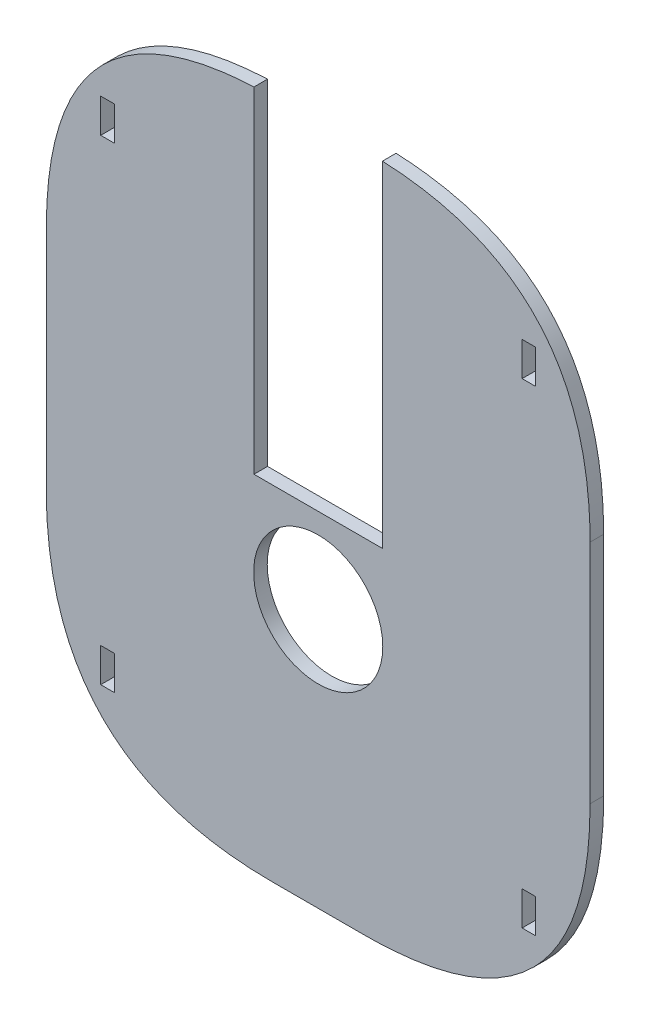
ISO-10303-21;
HEADER;
FILE_DESCRIPTION(('STEP AP214'),'2;1');
FILE_NAME('part.step','',(''),(''),'','','');
FILE_SCHEMA(('AUTOMOTIVE_DESIGN { 1 0 10303 214 1 1 1 1 }'));
ENDSEC;
DATA;
#1=APPLICATION_CONTEXT('core data for automotive mechanical design processes');
#2=APPLICATION_PROTOCOL_DEFINITION('international standard','automotive_design',2000,#1);
#3=PRODUCT_CONTEXT('',#1,'mechanical');
#4=PRODUCT('Part','Part','',(#3));
#5=PRODUCT_RELATED_PRODUCT_CATEGORY('part','',(#4));
#6=PRODUCT_DEFINITION_FORMATION('','',#4);
#7=PRODUCT_DEFINITION_CONTEXT('part definition',#1,'design');
#8=PRODUCT_DEFINITION('design','',#6,#7);
#9=PRODUCT_DEFINITION_SHAPE('','',#8);
#10=(LENGTH_UNIT() NAMED_UNIT(*) SI_UNIT(.MILLI.,.METRE.));
#11=(NAMED_UNIT(*) PLANE_ANGLE_UNIT() SI_UNIT($,.RADIAN.));
#12=(NAMED_UNIT(*) SI_UNIT($,.STERADIAN.) SOLID_ANGLE_UNIT());
#13=UNCERTAINTY_MEASURE_WITH_UNIT(LENGTH_MEASURE(1.E-05),#10,'distance_accuracy_value','');
#14=(GEOMETRIC_REPRESENTATION_CONTEXT(3) GLOBAL_UNCERTAINTY_ASSIGNED_CONTEXT((#13)) GLOBAL_UNIT_ASSIGNED_CONTEXT((#10,
#11,#12)) REPRESENTATION_CONTEXT('',''));
#15=CARTESIAN_POINT('',(0.,0.,0.));
#16=DIRECTION('',(0.,0.,1.));
#17=DIRECTION('',(1.,0.,0.));
#18=AXIS2_PLACEMENT_3D('',#15,#16,#17);
#19=CARTESIAN_POINT('',(0.,0.,5.08));
#20=DIRECTION('',(1.,0.,0.));
#21=DIRECTION('',(0.,0.,-1.));
#22=AXIS2_PLACEMENT_3D('',#19,#20,#21);
#23=PLANE('',#22);
#24=DIRECTION('',(0.,-1.,0.));
#25=VECTOR('',#24,1.);
#26=CARTESIAN_POINT('',(0.,0.,0.));
#27=LINE('',#26,#25);
#28=CARTESIAN_POINT('',(0.,169.333333333333,0.));
#29=VERTEX_POINT('',#28);
#30=CARTESIAN_POINT('',(0.,84.6666666666667,0.));
#31=VERTEX_POINT('',#30);
#32=EDGE_CURVE('E728',#29,#31,#27,.T.);
#33=ORIENTED_EDGE('',*,*,#32,.T.);
#34=CARTESIAN_POINT('',(0.,84.6666666666667,5.334));
#35=CARTESIAN_POINT('',(0.,84.6666666666667,3.47133333333333));
#36=CARTESIAN_POINT('',(0.,84.6666666666667,1.60866666666667));
#37=CARTESIAN_POINT('',(0.,84.6666666666667,-0.254));
#38=(BOUNDED_CURVE() B_SPLINE_CURVE(3,(#34,#35,#36,#37),.UNSPECIFIED.,.F.,
.F.) B_SPLINE_CURVE_WITH_KNOTS((4,4),(-0.000254,0.005334),
.UNSPECIFIED.) CURVE() GEOMETRIC_REPRESENTATION_ITEM() RATIONAL_B_SPLINE_CURVE((1.,1.,1.,1.)) REPRESENTATION_ITEM(''));
#39=CARTESIAN_POINT('',(0.,84.6666666666667,5.08));
#40=VERTEX_POINT('',#39);
#41=EDGE_CURVE('E362',#31,#40,#38,.F.);
#42=ORIENTED_EDGE('',*,*,#41,.T.);
#43=DIRECTION('',(0.,-1.,0.));
#44=VECTOR('',#43,1.);
#45=CARTESIAN_POINT('',(0.,0.,5.08));
#46=LINE('',#45,#44);
#47=CARTESIAN_POINT('',(0.,169.333333333333,5.08));
#48=VERTEX_POINT('',#47);
#49=EDGE_CURVE('E697',#48,#40,#46,.T.);
#50=ORIENTED_EDGE('',*,*,#49,.F.);
#51=CARTESIAN_POINT('',(0.,169.333333333333,-0.254));
#52=CARTESIAN_POINT('',(0.,169.333333333333,1.60866666666667));
#53=CARTESIAN_POINT('',(0.,169.333333333333,3.47133333333333));
#54=CARTESIAN_POINT('',(0.,169.333333333333,5.334));
#55=(BOUNDED_CURVE() B_SPLINE_CURVE(3,(#51,#52,#53,#54),.UNSPECIFIED.,.F.,
.F.) B_SPLINE_CURVE_WITH_KNOTS((4,4),(-0.000254,0.005334),
.UNSPECIFIED.) CURVE() GEOMETRIC_REPRESENTATION_ITEM() RATIONAL_B_SPLINE_CURVE((1.,1.,1.,1.)) REPRESENTATION_ITEM(''));
#56=EDGE_CURVE('E623',#48,#29,#55,.F.);
#57=ORIENTED_EDGE('',*,*,#56,.T.);
#58=EDGE_LOOP('',(#33,#42,#50,#57));
#59=FACE_BOUND('',#58,.T.);
#60=ADVANCED_FACE('F38',(#59),#23,.F.);
#61=CARTESIAN_POINT('',(0.,0.,5.08));
#62=DIRECTION('',(0.,1.,0.));
#63=DIRECTION('',(0.,0.,1.));
#64=AXIS2_PLACEMENT_3D('',#61,#62,#63);
#65=PLANE('',#64);
#66=DIRECTION('',(1.,0.,0.));
#67=VECTOR('',#66,1.);
#68=CARTESIAN_POINT('',(0.,0.,0.));
#69=LINE('',#68,#67);
#70=CARTESIAN_POINT('',(84.6666666666667,0.,0.));
#71=VERTEX_POINT('',#70);
#72=CARTESIAN_POINT('',(118.533333333333,0.,0.));
#73=VERTEX_POINT('',#72);
#74=EDGE_CURVE('E735',#71,#73,#69,.T.);
#75=ORIENTED_EDGE('',*,*,#74,.T.);
#76=CARTESIAN_POINT('',(118.533333333333,0.,5.334));
#77=CARTESIAN_POINT('',(118.533333333333,0.,3.47133333333333));
#78=CARTESIAN_POINT('',(118.533333333333,0.,1.60866666666667));
#79=CARTESIAN_POINT('',(118.533333333333,0.,-0.254));
#80=(BOUNDED_CURVE() B_SPLINE_CURVE(3,(#76,#77,#78,#79),.UNSPECIFIED.,.F.,
.F.) B_SPLINE_CURVE_WITH_KNOTS((4,4),(-0.000254,0.005334),
.UNSPECIFIED.) CURVE() GEOMETRIC_REPRESENTATION_ITEM() RATIONAL_B_SPLINE_CURVE((1.,1.,1.,1.)) REPRESENTATION_ITEM(''));
#81=CARTESIAN_POINT('',(118.533333333333,0.,5.08));
#82=VERTEX_POINT('',#81);
#83=EDGE_CURVE('E517',#73,#82,#80,.F.);
#84=ORIENTED_EDGE('',*,*,#83,.T.);
#85=DIRECTION('',(1.,0.,0.));
#86=VECTOR('',#85,1.);
#87=CARTESIAN_POINT('',(0.,0.,5.08));
#88=LINE('',#87,#86);
#89=CARTESIAN_POINT('',(84.6666666666667,0.,5.08));
#90=VERTEX_POINT('',#89);
#91=EDGE_CURVE('E687',#90,#82,#88,.T.);
#92=ORIENTED_EDGE('',*,*,#91,.F.);
#93=CARTESIAN_POINT('',(84.6666666666667,0.,-0.254));
#94=CARTESIAN_POINT('',(84.6666666666667,0.,1.60866666666667));
#95=CARTESIAN_POINT('',(84.6666666666667,0.,3.47133333333333));
#96=CARTESIAN_POINT('',(84.6666666666667,0.,5.334));
#97=(BOUNDED_CURVE() B_SPLINE_CURVE(3,(#93,#94,#95,#96),.UNSPECIFIED.,.F.,
.F.) B_SPLINE_CURVE_WITH_KNOTS((4,4),(-0.000254,0.005334),
.UNSPECIFIED.) CURVE() GEOMETRIC_REPRESENTATION_ITEM() RATIONAL_B_SPLINE_CURVE((1.,1.,1.,1.)) REPRESENTATION_ITEM(''));
#98=EDGE_CURVE('E740',#90,#71,#97,.F.);
#99=ORIENTED_EDGE('',*,*,#98,.T.);
#100=EDGE_LOOP('',(#75,#84,#92,#99));
#101=FACE_BOUND('',#100,.T.);
#102=ADVANCED_FACE('F447',(#101),#65,.F.);
#103=CARTESIAN_POINT('',(203.2,0.,5.08));
#104=DIRECTION('',(-1.,0.,0.));
#105=DIRECTION('',(0.,0.,1.));
#106=AXIS2_PLACEMENT_3D('',#103,#104,#105);
#107=PLANE('',#106);
#108=DIRECTION('',(0.,1.,0.));
#109=VECTOR('',#108,1.);
#110=CARTESIAN_POINT('',(203.2,0.,5.08));
#111=LINE('',#110,#109);
#112=CARTESIAN_POINT('',(203.2,84.6666666666667,5.08));
#113=VERTEX_POINT('',#112);
#114=CARTESIAN_POINT('',(203.2,169.333333333333,5.08));
#115=VERTEX_POINT('',#114);
#116=EDGE_CURVE('E696',#113,#115,#111,.T.);
#117=ORIENTED_EDGE('',*,*,#116,.F.);
#118=CARTESIAN_POINT('',(203.2,84.6666666666667,-0.254));
#119=CARTESIAN_POINT('',(203.2,84.6666666666667,1.60866666666667));
#120=CARTESIAN_POINT('',(203.2,84.6666666666667,3.47133333333333));
#121=CARTESIAN_POINT('',(203.2,84.6666666666667,5.334));
#122=(BOUNDED_CURVE() B_SPLINE_CURVE(3,(#118,#119,#120,#121),.UNSPECIFIED.,.F.,
.F.) B_SPLINE_CURVE_WITH_KNOTS((4,4),(-0.000254,0.005334),
.UNSPECIFIED.) CURVE() GEOMETRIC_REPRESENTATION_ITEM() RATIONAL_B_SPLINE_CURVE((1.,1.,1.,1.)) REPRESENTATION_ITEM(''));
#123=CARTESIAN_POINT('',(203.2,84.6666666666667,0.));
#124=VERTEX_POINT('',#123);
#125=EDGE_CURVE('E497',#113,#124,#122,.F.);
#126=ORIENTED_EDGE('',*,*,#125,.T.);
#127=DIRECTION('',(0.,1.,0.));
#128=VECTOR('',#127,1.);
#129=CARTESIAN_POINT('',(203.2,0.,0.));
#130=LINE('',#129,#128);
#131=CARTESIAN_POINT('',(203.2,169.333333333333,0.));
#132=VERTEX_POINT('',#131);
#133=EDGE_CURVE('E711',#124,#132,#130,.T.);
#134=ORIENTED_EDGE('',*,*,#133,.T.);
#135=CARTESIAN_POINT('',(203.2,169.333333333333,5.334));
#136=CARTESIAN_POINT('',(203.2,169.333333333333,3.47133333333333));
#137=CARTESIAN_POINT('',(203.2,169.333333333333,1.60866666666667));
#138=CARTESIAN_POINT('',(203.2,169.333333333333,-0.254));
#139=(BOUNDED_CURVE() B_SPLINE_CURVE(3,(#135,#136,#137,#138),.UNSPECIFIED.,.F.,
.F.) B_SPLINE_CURVE_WITH_KNOTS((4,4),(-0.000254,0.005334),
.UNSPECIFIED.) CURVE() GEOMETRIC_REPRESENTATION_ITEM() RATIONAL_B_SPLINE_CURVE((1.,1.,1.,1.)) REPRESENTATION_ITEM(''));
#140=EDGE_CURVE('E599',#132,#115,#139,.F.);
#141=ORIENTED_EDGE('',*,*,#140,.T.);
#142=EDGE_LOOP('',(#117,#126,#134,#141));
#143=FACE_BOUND('',#142,.T.);
#144=ADVANCED_FACE('F419',(#143),#107,.F.);
#145=CARTESIAN_POINT('',(0.,0.,5.08));
#146=DIRECTION('',(0.,0.,-1.));
#147=DIRECTION('',(-1.,0.,0.));
#148=AXIS2_PLACEMENT_3D('',#145,#146,#147);
#149=PLANE('',#148);
#150=DIRECTION('',(0.,-1.,0.));
#151=VECTOR('',#150,1.);
#152=CARTESIAN_POINT('',(20.32,44.45,5.08));
#153=LINE('',#152,#151);
#154=CARTESIAN_POINT('',(20.32,44.45,5.08));
#155=VERTEX_POINT('',#154);
#156=CARTESIAN_POINT('',(20.32,31.75,5.08));
#157=VERTEX_POINT('',#156);
#158=EDGE_CURVE('E272',#155,#157,#153,.T.);
#159=ORIENTED_EDGE('',*,*,#158,.F.);
#160=DIRECTION('',(-1.,0.,0.));
#161=VECTOR('',#160,1.);
#162=CARTESIAN_POINT('',(25.4,44.45,5.08));
#163=LINE('',#162,#161);
#164=CARTESIAN_POINT('',(25.4,44.45,5.08));
#165=VERTEX_POINT('',#164);
#166=EDGE_CURVE('E57',#165,#155,#163,.T.);
#167=ORIENTED_EDGE('',*,*,#166,.F.);
#168=DIRECTION('',(0.,1.,0.));
#169=VECTOR('',#168,1.);
#170=CARTESIAN_POINT('',(25.4,38.1,5.08));
#171=LINE('',#170,#169);
#172=CARTESIAN_POINT('',(25.4,31.75,5.08));
#173=VERTEX_POINT('',#172);
#174=EDGE_CURVE('E278',#173,#165,#171,.T.);
#175=ORIENTED_EDGE('',*,*,#174,.F.);
#176=DIRECTION('',(1.,0.,0.));
#177=VECTOR('',#176,1.);
#178=CARTESIAN_POINT('',(20.32,31.75,5.08));
#179=LINE('',#178,#177);
#180=EDGE_CURVE('E275',#157,#173,#179,.T.);
#181=ORIENTED_EDGE('',*,*,#180,.F.);
#182=EDGE_LOOP('',(#159,#167,#175,#181));
#183=FACE_BOUND('',#182,.T.);
#184=DIRECTION('',(1.,0.,0.));
#185=VECTOR('',#184,1.);
#186=CARTESIAN_POINT('',(182.88,31.75,5.08));
#187=LINE('',#186,#185);
#188=CARTESIAN_POINT('',(177.8,31.75,5.08));
#189=VERTEX_POINT('',#188);
#190=CARTESIAN_POINT('',(182.88,31.75,5.08));
#191=VERTEX_POINT('',#190);
#192=EDGE_CURVE('E253',#189,#191,#187,.T.);
#193=ORIENTED_EDGE('',*,*,#192,.F.);
#194=DIRECTION('',(0.,-1.,0.));
#195=VECTOR('',#194,1.);
#196=CARTESIAN_POINT('',(177.8,38.1,5.08));
#197=LINE('',#196,#195);
#198=CARTESIAN_POINT('',(177.8,44.45,5.08));
#199=VERTEX_POINT('',#198);
#200=EDGE_CURVE('E65',#199,#189,#197,.T.);
#201=ORIENTED_EDGE('',*,*,#200,.F.);
#202=DIRECTION('',(-1.,0.,0.));
#203=VECTOR('',#202,1.);
#204=CARTESIAN_POINT('',(177.8,44.45,5.08));
#205=LINE('',#204,#203);
#206=CARTESIAN_POINT('',(182.88,44.45,5.08));
#207=VERTEX_POINT('',#206);
#208=EDGE_CURVE('E260',#207,#199,#205,.T.);
#209=ORIENTED_EDGE('',*,*,#208,.F.);
#210=DIRECTION('',(0.,1.,0.));
#211=VECTOR('',#210,1.);
#212=CARTESIAN_POINT('',(182.88,44.45,5.08));
#213=LINE('',#212,#211);
#214=EDGE_CURVE('E256',#191,#207,#213,.T.);
#215=ORIENTED_EDGE('',*,*,#214,.F.);
#216=EDGE_LOOP('',(#193,#201,#209,#215));
#217=FACE_BOUND('',#216,.T.);
#218=DIRECTION('',(1.,0.,0.));
#219=VECTOR('',#218,1.);
#220=CARTESIAN_POINT('',(182.88,209.55,5.08));
#221=LINE('',#220,#219);
#222=CARTESIAN_POINT('',(177.8,209.55,5.08));
#223=VERTEX_POINT('',#222);
#224=CARTESIAN_POINT('',(182.88,209.55,5.08));
#225=VERTEX_POINT('',#224);
#226=EDGE_CURVE('E232',#223,#225,#221,.T.);
#227=ORIENTED_EDGE('',*,*,#226,.F.);
#228=DIRECTION('',(0.,-1.,0.));
#229=VECTOR('',#228,1.);
#230=CARTESIAN_POINT('',(177.8,215.9,5.08));
#231=LINE('',#230,#229);
#232=CARTESIAN_POINT('',(177.8,222.25,5.08));
#233=VERTEX_POINT('',#232);
#234=EDGE_CURVE('E244',#233,#223,#231,.T.);
#235=ORIENTED_EDGE('',*,*,#234,.F.);
#236=DIRECTION('',(-1.,0.,0.));
#237=VECTOR('',#236,1.);
#238=CARTESIAN_POINT('',(177.8,222.25,5.08));
#239=LINE('',#238,#237);
#240=CARTESIAN_POINT('',(182.88,222.25,5.08));
#241=VERTEX_POINT('',#240);
#242=EDGE_CURVE('E242',#241,#233,#239,.T.);
#243=ORIENTED_EDGE('',*,*,#242,.F.);
#244=DIRECTION('',(0.,1.,0.));
#245=VECTOR('',#244,1.);
#246=CARTESIAN_POINT('',(182.88,222.25,5.08));
#247=LINE('',#246,#245);
#248=EDGE_CURVE('E221',#225,#241,#247,.T.);
#249=ORIENTED_EDGE('',*,*,#248,.F.);
#250=EDGE_LOOP('',(#227,#235,#243,#249));
#251=FACE_BOUND('',#250,.T.);
#252=DIRECTION('',(1.,0.,0.));
#253=VECTOR('',#252,1.);
#254=CARTESIAN_POINT('',(20.32,209.55,5.08));
#255=LINE('',#254,#253);
#256=CARTESIAN_POINT('',(20.32,209.55,5.08));
#257=VERTEX_POINT('',#256);
#258=CARTESIAN_POINT('',(25.4,209.55,5.08));
#259=VERTEX_POINT('',#258);
#260=EDGE_CURVE('E289',#257,#259,#255,.T.);
#261=ORIENTED_EDGE('',*,*,#260,.F.);
#262=DIRECTION('',(0.,-1.,0.));
#263=VECTOR('',#262,1.);
#264=CARTESIAN_POINT('',(20.32,222.25,5.08));
#265=LINE('',#264,#263);
#266=CARTESIAN_POINT('',(20.32,222.25,5.08));
#267=VERTEX_POINT('',#266);
#268=EDGE_CURVE('E250',#267,#257,#265,.T.);
#269=ORIENTED_EDGE('',*,*,#268,.F.);
#270=DIRECTION('',(-1.,0.,0.));
#271=VECTOR('',#270,1.);
#272=CARTESIAN_POINT('',(25.4,222.25,5.08));
#273=LINE('',#272,#271);
#274=CARTESIAN_POINT('',(25.4,222.25,5.08));
#275=VERTEX_POINT('',#274);
#276=EDGE_CURVE('E295',#275,#267,#273,.T.);
#277=ORIENTED_EDGE('',*,*,#276,.F.);
#278=DIRECTION('',(0.,1.,0.));
#279=VECTOR('',#278,1.);
#280=CARTESIAN_POINT('',(25.4,215.9,5.08));
#281=LINE('',#280,#279);
#282=EDGE_CURVE('E292',#259,#275,#281,.T.);
#283=ORIENTED_EDGE('',*,*,#282,.F.);
#284=EDGE_LOOP('',(#261,#269,#277,#283));
#285=FACE_BOUND('',#284,.T.);
#286=CARTESIAN_POINT('',(101.6,96.7467296659947,5.08));
#287=DIRECTION('',(0.,0.,1.));
#288=DIRECTION('',(1.,0.,0.));
#289=AXIS2_PLACEMENT_3D('',#286,#287,#288);
#290=CIRCLE('',#289,24.13);
#291=CARTESIAN_POINT('',(125.73,96.7467296659947,5.08));
#292=VERTEX_POINT('',#291);
#293=EDGE_CURVE('E1046',#292,#292,#290,.T.);
#294=ORIENTED_EDGE('',*,*,#293,.F.);
#295=EDGE_LOOP('',(#294));
#296=FACE_BOUND('',#295,.T.);
#297=DIRECTION('',(1.,0.,0.));
#298=VECTOR('',#297,1.);
#299=CARTESIAN_POINT('',(77.597,128.496729665995,5.08));
#300=LINE('',#299,#298);
#301=CARTESIAN_POINT('',(77.597,128.496729665995,5.08));
#302=VERTEX_POINT('',#301);
#303=CARTESIAN_POINT('',(125.603,128.496729665995,5.08));
#304=VERTEX_POINT('',#303);
#305=EDGE_CURVE('E310',#302,#304,#300,.T.);
#306=ORIENTED_EDGE('',*,*,#305,.F.);
#307=DIRECTION('',(0.,-1.,0.));
#308=VECTOR('',#307,1.);
#309=CARTESIAN_POINT('',(77.597,254.,5.08));
#310=LINE('',#309,#308);
#311=CARTESIAN_POINT('',(77.597,253.84591766854,5.08));
#312=VERTEX_POINT('',#311);
#313=EDGE_CURVE('E301',#312,#302,#310,.T.);
#314=ORIENTED_EDGE('',*,*,#313,.F.);
#315=CARTESIAN_POINT('',(0.,169.333333333333,5.08));
#316=CARTESIAN_POINT('',(0.,254.,5.08));
#317=CARTESIAN_POINT('',(84.6666666666667,254.,5.08));
#318=(BOUNDED_CURVE() B_SPLINE_CURVE(2,(#315,#316,#317),.UNSPECIFIED.,.F.,
.F.) B_SPLINE_CURVE_WITH_KNOTS((3,3),(0.,1.),
.UNSPECIFIED.) CURVE() GEOMETRIC_REPRESENTATION_ITEM() RATIONAL_B_SPLINE_CURVE((1.,1.,1.)) REPRESENTATION_ITEM(''));
#319=EDGE_CURVE('E643',#312,#48,#318,.F.);
#320=ORIENTED_EDGE('',*,*,#319,.T.);
#321=ORIENTED_EDGE('',*,*,#49,.T.);
#322=CARTESIAN_POINT('',(84.6666666666667,0.,5.08));
#323=CARTESIAN_POINT('',(0.,0.,5.08));
#324=CARTESIAN_POINT('',(0.,84.6666666666667,5.08));
#325=(BOUNDED_CURVE() B_SPLINE_CURVE(2,(#322,#323,#324),.UNSPECIFIED.,.F.,
.F.) B_SPLINE_CURVE_WITH_KNOTS((3,3),(0.,1.),
.UNSPECIFIED.) CURVE() GEOMETRIC_REPRESENTATION_ITEM() RATIONAL_B_SPLINE_CURVE((1.,1.,1.)) REPRESENTATION_ITEM(''));
#326=EDGE_CURVE('E745',#40,#90,#325,.F.);
#327=ORIENTED_EDGE('',*,*,#326,.T.);
#328=ORIENTED_EDGE('',*,*,#91,.T.);
#329=CARTESIAN_POINT('',(203.2,84.6666666666667,5.08));
#330=CARTESIAN_POINT('',(203.2,0.,5.08));
#331=CARTESIAN_POINT('',(118.533333333333,0.,5.08));
#332=(BOUNDED_CURVE() B_SPLINE_CURVE(2,(#329,#330,#331),.UNSPECIFIED.,.F.,
.F.) B_SPLINE_CURVE_WITH_KNOTS((3,3),(0.,1.),
.UNSPECIFIED.) CURVE() GEOMETRIC_REPRESENTATION_ITEM() RATIONAL_B_SPLINE_CURVE((1.,1.,1.)) REPRESENTATION_ITEM(''));
#333=EDGE_CURVE('E507',#82,#113,#332,.F.);
#334=ORIENTED_EDGE('',*,*,#333,.T.);
#335=ORIENTED_EDGE('',*,*,#116,.T.);
#336=CARTESIAN_POINT('',(118.533333333333,254.,5.08));
#337=CARTESIAN_POINT('',(203.2,254.,5.08));
#338=CARTESIAN_POINT('',(203.2,169.333333333333,5.08));
#339=(BOUNDED_CURVE() B_SPLINE_CURVE(2,(#336,#337,#338),.UNSPECIFIED.,.F.,
.F.) B_SPLINE_CURVE_WITH_KNOTS((3,3),(0.,1.),
.UNSPECIFIED.) CURVE() GEOMETRIC_REPRESENTATION_ITEM() RATIONAL_B_SPLINE_CURVE((1.,1.,1.)) REPRESENTATION_ITEM(''));
#340=CARTESIAN_POINT('',(125.603,253.84591766854,5.08));
#341=VERTEX_POINT('',#340);
#342=EDGE_CURVE('E346',#115,#341,#339,.F.);
#343=ORIENTED_EDGE('',*,*,#342,.T.);
#344=DIRECTION('',(0.,1.,0.));
#345=VECTOR('',#344,1.);
#346=CARTESIAN_POINT('',(125.603,254.,5.08));
#347=LINE('',#346,#345);
#348=EDGE_CURVE('E318',#304,#341,#347,.T.);
#349=ORIENTED_EDGE('',*,*,#348,.F.);
#350=EDGE_LOOP('',(#306,#314,#320,#321,#327,#328,#334,#335,#343,#349));
#351=FACE_BOUND('',#350,.T.);
#352=ADVANCED_FACE('F239',(#183,#217,#251,#285,#296,#351),#149,.F.);
#353=CARTESIAN_POINT('',(0.,0.,0.));
#354=DIRECTION('',(0.,0.,-1.));
#355=DIRECTION('',(-1.,0.,0.));
#356=AXIS2_PLACEMENT_3D('',#353,#354,#355);
#357=PLANE('',#356);
#358=DIRECTION('',(1.,0.,0.));
#359=VECTOR('',#358,1.);
#360=CARTESIAN_POINT('',(0.,44.45,0.));
#361=LINE('',#360,#359);
#362=CARTESIAN_POINT('',(20.32,44.45,0.));
#363=VERTEX_POINT('',#362);
#364=CARTESIAN_POINT('',(25.4,44.45,0.));
#365=VERTEX_POINT('',#364);
#366=EDGE_CURVE('E12',#363,#365,#361,.T.);
#367=ORIENTED_EDGE('',*,*,#366,.F.);
#368=DIRECTION('',(0.,1.,0.));
#369=VECTOR('',#368,1.);
#370=CARTESIAN_POINT('',(20.32,0.,0.));
#371=LINE('',#370,#369);
#372=CARTESIAN_POINT('',(20.32,31.75,0.));
#373=VERTEX_POINT('',#372);
#374=EDGE_CURVE('E393',#373,#363,#371,.T.);
#375=ORIENTED_EDGE('',*,*,#374,.F.);
#376=DIRECTION('',(-1.,0.,0.));
#377=VECTOR('',#376,1.);
#378=CARTESIAN_POINT('',(0.,31.75,0.));
#379=LINE('',#378,#377);
#380=CARTESIAN_POINT('',(25.4,31.75,0.));
#381=VERTEX_POINT('',#380);
#382=EDGE_CURVE('E395',#381,#373,#379,.T.);
#383=ORIENTED_EDGE('',*,*,#382,.F.);
#384=DIRECTION('',(0.,-1.,0.));
#385=VECTOR('',#384,1.);
#386=CARTESIAN_POINT('',(25.4,0.,0.));
#387=LINE('',#386,#385);
#388=EDGE_CURVE('E50',#365,#381,#387,.T.);
#389=ORIENTED_EDGE('',*,*,#388,.F.);
#390=EDGE_LOOP('',(#367,#375,#383,#389));
#391=FACE_BOUND('',#390,.T.);
#392=DIRECTION('',(0.,1.,0.));
#393=VECTOR('',#392,1.);
#394=CARTESIAN_POINT('',(177.8,0.,0.));
#395=LINE('',#394,#393);
#396=CARTESIAN_POINT('',(177.8,31.75,0.));
#397=VERTEX_POINT('',#396);
#398=CARTESIAN_POINT('',(177.8,44.45,0.));
#399=VERTEX_POINT('',#398);
#400=EDGE_CURVE('E391',#397,#399,#395,.T.);
#401=ORIENTED_EDGE('',*,*,#400,.F.);
#402=DIRECTION('',(-1.,0.,0.));
#403=VECTOR('',#402,1.);
#404=CARTESIAN_POINT('',(0.,31.75,0.));
#405=LINE('',#404,#403);
#406=CARTESIAN_POINT('',(182.88,31.75,0.));
#407=VERTEX_POINT('',#406);
#408=EDGE_CURVE('E384',#407,#397,#405,.T.);
#409=ORIENTED_EDGE('',*,*,#408,.F.);
#410=DIRECTION('',(0.,-1.,0.));
#411=VECTOR('',#410,1.);
#412=CARTESIAN_POINT('',(182.88,0.,0.));
#413=LINE('',#412,#411);
#414=CARTESIAN_POINT('',(182.88,44.45,0.));
#415=VERTEX_POINT('',#414);
#416=EDGE_CURVE('E386',#415,#407,#413,.T.);
#417=ORIENTED_EDGE('',*,*,#416,.F.);
#418=DIRECTION('',(1.,0.,0.));
#419=VECTOR('',#418,1.);
#420=CARTESIAN_POINT('',(0.,44.45,0.));
#421=LINE('',#420,#419);
#422=EDGE_CURVE('E389',#399,#415,#421,.T.);
#423=ORIENTED_EDGE('',*,*,#422,.F.);
#424=EDGE_LOOP('',(#401,#409,#417,#423));
#425=FACE_BOUND('',#424,.T.);
#426=DIRECTION('',(0.,1.,0.));
#427=VECTOR('',#426,1.);
#428=CARTESIAN_POINT('',(177.8,0.,0.));
#429=LINE('',#428,#427);
#430=CARTESIAN_POINT('',(177.8,209.55,0.));
#431=VERTEX_POINT('',#430);
#432=CARTESIAN_POINT('',(177.8,222.25,0.));
#433=VERTEX_POINT('',#432);
#434=EDGE_CURVE('E382',#431,#433,#429,.T.);
#435=ORIENTED_EDGE('',*,*,#434,.F.);
#436=DIRECTION('',(-1.,0.,0.));
#437=VECTOR('',#436,1.);
#438=CARTESIAN_POINT('',(0.,209.55,0.));
#439=LINE('',#438,#437);
#440=CARTESIAN_POINT('',(182.88,209.55,0.));
#441=VERTEX_POINT('',#440);
#442=EDGE_CURVE('E377',#441,#431,#439,.T.);
#443=ORIENTED_EDGE('',*,*,#442,.F.);
#444=DIRECTION('',(0.,-1.,0.));
#445=VECTOR('',#444,1.);
#446=CARTESIAN_POINT('',(182.88,0.,0.));
#447=LINE('',#446,#445);
#448=CARTESIAN_POINT('',(182.88,222.25,0.));
#449=VERTEX_POINT('',#448);
#450=EDGE_CURVE('E224',#449,#441,#447,.T.);
#451=ORIENTED_EDGE('',*,*,#450,.F.);
#452=DIRECTION('',(1.,0.,0.));
#453=VECTOR('',#452,1.);
#454=CARTESIAN_POINT('',(0.,222.25,0.));
#455=LINE('',#454,#453);
#456=EDGE_CURVE('E380',#433,#449,#455,.T.);
#457=ORIENTED_EDGE('',*,*,#456,.F.);
#458=EDGE_LOOP('',(#435,#443,#451,#457));
#459=FACE_BOUND('',#458,.T.);
#460=DIRECTION('',(0.,1.,0.));
#461=VECTOR('',#460,1.);
#462=CARTESIAN_POINT('',(20.32,0.,0.));
#463=LINE('',#462,#461);
#464=CARTESIAN_POINT('',(20.32,209.55,0.));
#465=VERTEX_POINT('',#464);
#466=CARTESIAN_POINT('',(20.32,222.25,0.));
#467=VERTEX_POINT('',#466);
#468=EDGE_CURVE('E375',#465,#467,#463,.T.);
#469=ORIENTED_EDGE('',*,*,#468,.F.);
#470=DIRECTION('',(-1.,0.,0.));
#471=VECTOR('',#470,1.);
#472=CARTESIAN_POINT('',(-1.14491749414469E-12,209.55,0.));
#473=LINE('',#472,#471);
#474=CARTESIAN_POINT('',(25.4,209.55,0.));
#475=VERTEX_POINT('',#474);
#476=EDGE_CURVE('E360',#475,#465,#473,.T.);
#477=ORIENTED_EDGE('',*,*,#476,.F.);
#478=DIRECTION('',(0.,-1.,0.));
#479=VECTOR('',#478,1.);
#480=CARTESIAN_POINT('',(25.4,0.,0.));
#481=LINE('',#480,#479);
#482=CARTESIAN_POINT('',(25.4,222.25,0.));
#483=VERTEX_POINT('',#482);
#484=EDGE_CURVE('E370',#483,#475,#481,.T.);
#485=ORIENTED_EDGE('',*,*,#484,.F.);
#486=DIRECTION('',(1.,0.,0.));
#487=VECTOR('',#486,1.);
#488=CARTESIAN_POINT('',(0.,222.25,0.));
#489=LINE('',#488,#487);
#490=EDGE_CURVE('E373',#467,#483,#489,.T.);
#491=ORIENTED_EDGE('',*,*,#490,.F.);
#492=EDGE_LOOP('',(#469,#477,#485,#491));
#493=FACE_BOUND('',#492,.T.);
#494=DIRECTION('',(0.,1.,0.));
#495=VECTOR('',#494,1.);
#496=CARTESIAN_POINT('',(77.597,0.,0.));
#497=LINE('',#496,#495);
#498=CARTESIAN_POINT('',(77.597,128.496729665995,0.));
#499=VERTEX_POINT('',#498);
#500=CARTESIAN_POINT('',(77.5969999999997,253.84591766854,0.));
#501=VERTEX_POINT('',#500);
#502=EDGE_CURVE('E320',#499,#501,#497,.T.);
#503=ORIENTED_EDGE('',*,*,#502,.F.);
#504=DIRECTION('',(-1.,0.,0.));
#505=VECTOR('',#504,1.);
#506=CARTESIAN_POINT('',(0.,128.496729665995,0.));
#507=LINE('',#506,#505);
#508=CARTESIAN_POINT('',(125.603,128.496729665995,0.));
#509=VERTEX_POINT('',#508);
#510=EDGE_CURVE('E334',#509,#499,#507,.T.);
#511=ORIENTED_EDGE('',*,*,#510,.F.);
#512=DIRECTION('',(0.,-1.,0.));
#513=VECTOR('',#512,1.);
#514=CARTESIAN_POINT('',(125.603,0.,0.));
#515=LINE('',#514,#513);
#516=CARTESIAN_POINT('',(125.603,253.84591766854,0.));
#517=VERTEX_POINT('',#516);
#518=EDGE_CURVE('E327',#517,#509,#515,.T.);
#519=ORIENTED_EDGE('',*,*,#518,.F.);
#520=CARTESIAN_POINT('',(203.2,169.333333333333,0.));
#521=CARTESIAN_POINT('',(203.2,254.,0.));
#522=CARTESIAN_POINT('',(118.533333333333,254.,0.));
#523=(BOUNDED_CURVE() B_SPLINE_CURVE(2,(#520,#521,#522),.UNSPECIFIED.,.F.,
.F.) B_SPLINE_CURVE_WITH_KNOTS((3,3),(0.,1.),
.UNSPECIFIED.) CURVE() GEOMETRIC_REPRESENTATION_ITEM() RATIONAL_B_SPLINE_CURVE((1.,1.,1.)) REPRESENTATION_ITEM(''));
#524=EDGE_CURVE('E357',#517,#132,#523,.F.);
#525=ORIENTED_EDGE('',*,*,#524,.T.);
#526=ORIENTED_EDGE('',*,*,#133,.F.);
#527=CARTESIAN_POINT('',(118.533333333333,0.,0.));
#528=CARTESIAN_POINT('',(203.2,0.,0.));
#529=CARTESIAN_POINT('',(203.2,84.6666666666667,0.));
#530=(BOUNDED_CURVE() B_SPLINE_CURVE(2,(#527,#528,#529),.UNSPECIFIED.,.F.,
.F.) B_SPLINE_CURVE_WITH_KNOTS((3,3),(0.,1.),
.UNSPECIFIED.) CURVE() GEOMETRIC_REPRESENTATION_ITEM() RATIONAL_B_SPLINE_CURVE((1.,1.,1.)) REPRESENTATION_ITEM(''));
#531=EDGE_CURVE('E485',#124,#73,#530,.F.);
#532=ORIENTED_EDGE('',*,*,#531,.T.);
#533=ORIENTED_EDGE('',*,*,#74,.F.);
#534=CARTESIAN_POINT('',(0.,84.6666666666667,0.));
#535=CARTESIAN_POINT('',(0.,0.,0.));
#536=CARTESIAN_POINT('',(84.6666666666667,0.,0.));
#537=(BOUNDED_CURVE() B_SPLINE_CURVE(2,(#534,#535,#536),.UNSPECIFIED.,.F.,
.F.) B_SPLINE_CURVE_WITH_KNOTS((3,3),(0.,1.),
.UNSPECIFIED.) CURVE() GEOMETRIC_REPRESENTATION_ITEM() RATIONAL_B_SPLINE_CURVE((1.,1.,1.)) REPRESENTATION_ITEM(''));
#538=EDGE_CURVE('E530',#71,#31,#537,.F.);
#539=ORIENTED_EDGE('',*,*,#538,.T.);
#540=ORIENTED_EDGE('',*,*,#32,.F.);
#541=CARTESIAN_POINT('',(84.6666666666667,254.,0.));
#542=CARTESIAN_POINT('',(0.,254.,0.));
#543=CARTESIAN_POINT('',(0.,169.333333333333,0.));
#544=(BOUNDED_CURVE() B_SPLINE_CURVE(2,(#541,#542,#543),.UNSPECIFIED.,.F.,
.F.) B_SPLINE_CURVE_WITH_KNOTS((3,3),(0.,1.),
.UNSPECIFIED.) CURVE() GEOMETRIC_REPRESENTATION_ITEM() RATIONAL_B_SPLINE_CURVE((1.,1.,1.)) REPRESENTATION_ITEM(''));
#545=EDGE_CURVE('E612',#29,#501,#544,.F.);
#546=ORIENTED_EDGE('',*,*,#545,.T.);
#547=EDGE_LOOP('',(#503,#511,#519,#525,#526,#532,#533,#539,#540,#546));
#548=FACE_BOUND('',#547,.T.);
#549=CARTESIAN_POINT('',(101.6,96.7467296659947,0.));
#550=DIRECTION('',(0.,0.,-1.));
#551=DIRECTION('',(-1.,0.,0.));
#552=AXIS2_PLACEMENT_3D('',#549,#550,#551);
#553=CIRCLE('',#552,24.13);
#554=CARTESIAN_POINT('',(77.47,96.7467296659947,0.));
#555=VERTEX_POINT('',#554);
#556=EDGE_CURVE('E635',#555,#555,#553,.T.);
#557=ORIENTED_EDGE('',*,*,#556,.F.);
#558=EDGE_LOOP('',(#557));
#559=FACE_BOUND('',#558,.T.);
#560=ADVANCED_FACE('F410',(#391,#425,#459,#493,#548,#559),#357,.T.);
#561=CARTESIAN_POINT('',(203.2,84.6666666666667,5.334));
#562=CARTESIAN_POINT('',(203.2,84.6666666666667,3.47133333333333));
#563=CARTESIAN_POINT('',(203.2,84.6666666666667,1.60866666666667));
#564=CARTESIAN_POINT('',(203.2,84.6666666666667,-0.254));
#565=CARTESIAN_POINT('',(203.2,0.,5.334));
#566=CARTESIAN_POINT('',(203.2,0.,3.47133333333334));
#567=CARTESIAN_POINT('',(203.2,0.,1.60866666666667));
#568=CARTESIAN_POINT('',(203.2,0.,-0.254));
#569=CARTESIAN_POINT('',(118.533333333333,0.,5.334));
#570=CARTESIAN_POINT('',(118.533333333333,0.,3.47133333333333));
#571=CARTESIAN_POINT('',(118.533333333333,0.,1.60866666666667));
#572=CARTESIAN_POINT('',(118.533333333333,0.,-0.254));
#573=(BOUNDED_SURFACE() B_SPLINE_SURFACE(2,3,((#561,#562,#563,#564),(#565,#566,#567,#568),(#569,
#570,#571,#572)),.UNSPECIFIED.,.F.,.F.,.F.) B_SPLINE_SURFACE_WITH_KNOTS((3,3),(4,4),(0.,1.),
(-0.000254,0.005334),
.UNSPECIFIED.) GEOMETRIC_REPRESENTATION_ITEM() RATIONAL_B_SPLINE_SURFACE(((1.,1.,1.,1.),(1.,1.,
1.,1.),(1.,1.,1.,1.))) REPRESENTATION_ITEM('') SURFACE());
#574=ORIENTED_EDGE('',*,*,#333,.F.);
#575=ORIENTED_EDGE('',*,*,#83,.F.);
#576=ORIENTED_EDGE('',*,*,#531,.F.);
#577=ORIENTED_EDGE('',*,*,#125,.F.);
#578=EDGE_LOOP('',(#574,#575,#576,#577));
#579=FACE_BOUND('',#578,.T.);
#580=ADVANCED_FACE('F461',(#579),#573,.T.);
#581=CARTESIAN_POINT('',(84.6666666666667,0.,5.334));
#582=CARTESIAN_POINT('',(84.6666666666667,0.,3.47133333333333));
#583=CARTESIAN_POINT('',(84.6666666666667,0.,1.60866666666667));
#584=CARTESIAN_POINT('',(84.6666666666667,0.,-0.254));
#585=CARTESIAN_POINT('',(0.,0.,5.334));
#586=CARTESIAN_POINT('',(0.,0.,3.47133333333334));
#587=CARTESIAN_POINT('',(0.,0.,1.60866666666667));
#588=CARTESIAN_POINT('',(0.,0.,-0.254));
#589=CARTESIAN_POINT('',(0.,84.6666666666667,5.334));
#590=CARTESIAN_POINT('',(0.,84.6666666666667,3.47133333333333));
#591=CARTESIAN_POINT('',(0.,84.6666666666667,1.60866666666667));
#592=CARTESIAN_POINT('',(0.,84.6666666666667,-0.254));
#593=(BOUNDED_SURFACE() B_SPLINE_SURFACE(2,3,((#581,#582,#583,#584),(#585,#586,#587,#588),(#589,
#590,#591,#592)),.UNSPECIFIED.,.F.,.F.,.F.) B_SPLINE_SURFACE_WITH_KNOTS((3,3),(4,4),(0.,1.),
(-0.000254,0.005334),
.UNSPECIFIED.) GEOMETRIC_REPRESENTATION_ITEM() RATIONAL_B_SPLINE_SURFACE(((1.,1.,1.,1.),(1.,1.,
1.,1.),(1.,1.,1.,1.))) REPRESENTATION_ITEM('') SURFACE());
#594=ORIENTED_EDGE('',*,*,#326,.F.);
#595=ORIENTED_EDGE('',*,*,#41,.F.);
#596=ORIENTED_EDGE('',*,*,#538,.F.);
#597=ORIENTED_EDGE('',*,*,#98,.F.);
#598=EDGE_LOOP('',(#594,#595,#596,#597));
#599=FACE_BOUND('',#598,.T.);
#600=ADVANCED_FACE('F537',(#599),#593,.T.);
#601=CARTESIAN_POINT('',(118.533333333333,254.,5.334));
#602=CARTESIAN_POINT('',(118.533333333333,254.,3.47133333333333));
#603=CARTESIAN_POINT('',(118.533333333333,254.,1.60866666666667));
#604=CARTESIAN_POINT('',(118.533333333333,254.,-0.254));
#605=CARTESIAN_POINT('',(203.2,254.,5.334));
#606=CARTESIAN_POINT('',(203.2,254.,3.47133333333334));
#607=CARTESIAN_POINT('',(203.2,254.,1.60866666666667));
#608=CARTESIAN_POINT('',(203.2,254.,-0.254));
#609=CARTESIAN_POINT('',(203.2,169.333333333333,5.334));
#610=CARTESIAN_POINT('',(203.2,169.333333333333,3.47133333333333));
#611=CARTESIAN_POINT('',(203.2,169.333333333333,1.60866666666667));
#612=CARTESIAN_POINT('',(203.2,169.333333333333,-0.254));
#613=(BOUNDED_SURFACE() B_SPLINE_SURFACE(2,3,((#601,#602,#603,#604),(#605,#606,#607,#608),(#609,
#610,#611,#612)),.UNSPECIFIED.,.F.,.F.,.F.) B_SPLINE_SURFACE_WITH_KNOTS((3,3),(4,4),(0.,1.),
(-0.000254,0.005334),
.UNSPECIFIED.) GEOMETRIC_REPRESENTATION_ITEM() RATIONAL_B_SPLINE_SURFACE(((1.,1.,1.,1.),(1.,1.,
1.,1.),(1.,1.,1.,1.))) REPRESENTATION_ITEM('') SURFACE());
#614=DIRECTION('',(0.,0.,-1.));
#615=VECTOR('',#614,1.);
#616=CARTESIAN_POINT('',(125.603,253.84591766854,2.54));
#617=LINE('',#616,#615);
#618=EDGE_CURVE('E350',#341,#517,#617,.T.);
#619=ORIENTED_EDGE('',*,*,#618,.F.);
#620=ORIENTED_EDGE('',*,*,#342,.F.);
#621=ORIENTED_EDGE('',*,*,#140,.F.);
#622=ORIENTED_EDGE('',*,*,#524,.F.);
#623=EDGE_LOOP('',(#619,#620,#621,#622));
#624=FACE_BOUND('',#623,.T.);
#625=ADVANCED_FACE('F354',(#624),#613,.T.);
#626=CARTESIAN_POINT('',(0.,169.333333333333,5.334));
#627=CARTESIAN_POINT('',(0.,169.333333333333,3.47133333333333));
#628=CARTESIAN_POINT('',(0.,169.333333333333,1.60866666666667));
#629=CARTESIAN_POINT('',(0.,169.333333333333,-0.254));
#630=CARTESIAN_POINT('',(0.,254.,5.334));
#631=CARTESIAN_POINT('',(0.,254.,3.47133333333334));
#632=CARTESIAN_POINT('',(0.,254.,1.60866666666667));
#633=CARTESIAN_POINT('',(0.,254.,-0.254));
#634=CARTESIAN_POINT('',(84.6666666666667,254.,5.334));
#635=CARTESIAN_POINT('',(84.6666666666667,254.,3.47133333333333));
#636=CARTESIAN_POINT('',(84.6666666666667,254.,1.60866666666667));
#637=CARTESIAN_POINT('',(84.6666666666667,254.,-0.254));
#638=(BOUNDED_SURFACE() B_SPLINE_SURFACE(2,3,((#626,#627,#628,#629),(#630,#631,#632,#633),(#634,
#635,#636,#637)),.UNSPECIFIED.,.F.,.F.,.F.) B_SPLINE_SURFACE_WITH_KNOTS((3,3),(4,4),(0.,1.),
(-0.000254,0.005334),
.UNSPECIFIED.) GEOMETRIC_REPRESENTATION_ITEM() RATIONAL_B_SPLINE_SURFACE(((1.,1.,1.,1.),(1.,1.,
1.,1.),(1.,1.,1.,1.))) REPRESENTATION_ITEM('') SURFACE());
#639=DIRECTION('',(0.,0.,-1.));
#640=VECTOR('',#639,1.);
#641=CARTESIAN_POINT('',(77.597,253.84591766854,2.54));
#642=LINE('',#641,#640);
#643=EDGE_CURVE('E340',#501,#312,#642,.F.);
#644=ORIENTED_EDGE('',*,*,#643,.F.);
#645=ORIENTED_EDGE('',*,*,#545,.F.);
#646=ORIENTED_EDGE('',*,*,#56,.F.);
#647=ORIENTED_EDGE('',*,*,#319,.F.);
#648=EDGE_LOOP('',(#644,#645,#646,#647));
#649=FACE_BOUND('',#648,.T.);
#650=ADVANCED_FACE('F41',(#649),#638,.T.);
#651=CARTESIAN_POINT('',(101.6,96.7467296659947,-0.423333333333335));
#652=DIRECTION('',(0.,0.,1.));
#653=DIRECTION('',(1.,0.,0.));
#654=AXIS2_PLACEMENT_3D('',#651,#652,#653);
#655=CYLINDRICAL_SURFACE('',#654,24.13);
#656=ORIENTED_EDGE('',*,*,#556,.T.);
#657=EDGE_LOOP('',(#656));
#658=FACE_BOUND('',#657,.T.);
#659=ORIENTED_EDGE('',*,*,#293,.T.);
#660=EDGE_LOOP('',(#659));
#661=FACE_BOUND('',#660,.T.);
#662=ADVANCED_FACE('F831',(#658,#661),#655,.F.);
#663=CARTESIAN_POINT('',(77.597,254.,-0.423333333333335));
#664=DIRECTION('',(-1.,0.,0.));
#665=DIRECTION('',(0.,-1.,0.));
#666=AXIS2_PLACEMENT_3D('',#663,#664,#665);
#667=PLANE('',#666);
#668=ORIENTED_EDGE('',*,*,#502,.T.);
#669=ORIENTED_EDGE('',*,*,#643,.T.);
#670=ORIENTED_EDGE('',*,*,#313,.T.);
#671=DIRECTION('',(0.,0.,1.));
#672=VECTOR('',#671,1.);
#673=CARTESIAN_POINT('',(77.597,128.496729665995,-0.423333333333335));
#674=LINE('',#673,#672);
#675=EDGE_CURVE('E316',#499,#302,#674,.T.);
#676=ORIENTED_EDGE('',*,*,#675,.F.);
#677=EDGE_LOOP('',(#668,#669,#670,#676));
#678=FACE_BOUND('',#677,.T.);
#679=ADVANCED_FACE('F338',(#678),#667,.F.);
#680=CARTESIAN_POINT('',(125.603,254.,-0.423333333333335));
#681=DIRECTION('',(1.,0.,0.));
#682=DIRECTION('',(0.,1.,0.));
#683=AXIS2_PLACEMENT_3D('',#680,#681,#682);
#684=PLANE('',#683);
#685=ORIENTED_EDGE('',*,*,#518,.T.);
#686=DIRECTION('',(0.,0.,1.));
#687=VECTOR('',#686,1.);
#688=CARTESIAN_POINT('',(125.603,128.496729665995,-0.423333333333335));
#689=LINE('',#688,#687);
#690=EDGE_CURVE('E323',#509,#304,#689,.T.);
#691=ORIENTED_EDGE('',*,*,#690,.T.);
#692=ORIENTED_EDGE('',*,*,#348,.T.);
#693=ORIENTED_EDGE('',*,*,#618,.T.);
#694=EDGE_LOOP('',(#685,#691,#692,#693));
#695=FACE_BOUND('',#694,.T.);
#696=ADVANCED_FACE('F349',(#695),#684,.F.);
#697=CARTESIAN_POINT('',(77.597,128.496729665995,-0.423333333333335));
#698=DIRECTION('',(0.,-1.,0.));
#699=DIRECTION('',(0.,0.,-1.));
#700=AXIS2_PLACEMENT_3D('',#697,#698,#699);
#701=PLANE('',#700);
#702=ORIENTED_EDGE('',*,*,#510,.T.);
#703=ORIENTED_EDGE('',*,*,#675,.T.);
#704=ORIENTED_EDGE('',*,*,#305,.T.);
#705=ORIENTED_EDGE('',*,*,#690,.F.);
#706=EDGE_LOOP('',(#702,#703,#704,#705));
#707=FACE_BOUND('',#706,.T.);
#708=ADVANCED_FACE('F330',(#707),#701,.F.);
#709=CARTESIAN_POINT('',(20.32,222.25,-0.423333333333403));
#710=DIRECTION('',(-1.,0.,0.));
#711=DIRECTION('',(0.,0.,1.));
#712=AXIS2_PLACEMENT_3D('',#709,#710,#711);
#713=PLANE('',#712);
#714=ORIENTED_EDGE('',*,*,#468,.T.);
#715=DIRECTION('',(0.,0.,1.));
#716=VECTOR('',#715,1.);
#717=CARTESIAN_POINT('',(20.32,222.25,-0.423333333333403));
#718=LINE('',#717,#716);
#719=EDGE_CURVE('E299',#467,#267,#718,.T.);
#720=ORIENTED_EDGE('',*,*,#719,.T.);
#721=ORIENTED_EDGE('',*,*,#268,.T.);
#722=DIRECTION('',(0.,0.,1.));
#723=VECTOR('',#722,1.);
#724=CARTESIAN_POINT('',(20.32,209.55,-0.423333333333403));
#725=LINE('',#724,#723);
#726=EDGE_CURVE('E298',#465,#257,#725,.T.);
#727=ORIENTED_EDGE('',*,*,#726,.F.);
#728=EDGE_LOOP('',(#714,#720,#721,#727));
#729=FACE_BOUND('',#728,.T.);
#730=ADVANCED_FACE('F853',(#729),#713,.F.);
#731=CARTESIAN_POINT('',(25.4,222.25,-0.423333333333403));
#732=DIRECTION('',(0.,1.,0.));
#733=DIRECTION('',(0.,0.,1.));
#734=AXIS2_PLACEMENT_3D('',#731,#732,#733);
#735=PLANE('',#734);
#736=ORIENTED_EDGE('',*,*,#490,.T.);
#737=DIRECTION('',(0.,0.,1.));
#738=VECTOR('',#737,1.);
#739=CARTESIAN_POINT('',(25.4,222.25,-0.423333333333403));
#740=LINE('',#739,#738);
#741=EDGE_CURVE('E302',#483,#275,#740,.T.);
#742=ORIENTED_EDGE('',*,*,#741,.T.);
#743=ORIENTED_EDGE('',*,*,#276,.T.);
#744=ORIENTED_EDGE('',*,*,#719,.F.);
#745=EDGE_LOOP('',(#736,#742,#743,#744));
#746=FACE_BOUND('',#745,.T.);
#747=ADVANCED_FACE('F859',(#746),#735,.F.);
#748=CARTESIAN_POINT('',(25.4,215.9,-0.423333333333403));
#749=DIRECTION('',(1.,0.,0.));
#750=DIRECTION('',(0.,0.,-1.));
#751=AXIS2_PLACEMENT_3D('',#748,#749,#750);
#752=PLANE('',#751);
#753=ORIENTED_EDGE('',*,*,#484,.T.);
#754=DIRECTION('',(0.,0.,1.));
#755=VECTOR('',#754,1.);
#756=CARTESIAN_POINT('',(25.4,209.55,-0.423333333333403));
#757=LINE('',#756,#755);
#758=EDGE_CURVE('E304',#475,#259,#757,.T.);
#759=ORIENTED_EDGE('',*,*,#758,.T.);
#760=ORIENTED_EDGE('',*,*,#282,.T.);
#761=ORIENTED_EDGE('',*,*,#741,.F.);
#762=EDGE_LOOP('',(#753,#759,#760,#761));
#763=FACE_BOUND('',#762,.T.);
#764=ADVANCED_FACE('F867',(#763),#752,.F.);
#765=CARTESIAN_POINT('',(20.32,209.55,-0.423333333333403));
#766=DIRECTION('',(0.,-1.,0.));
#767=DIRECTION('',(1.,0.,0.));
#768=AXIS2_PLACEMENT_3D('',#765,#766,#767);
#769=PLANE('',#768);
#770=ORIENTED_EDGE('',*,*,#476,.T.);
#771=ORIENTED_EDGE('',*,*,#726,.T.);
#772=ORIENTED_EDGE('',*,*,#260,.T.);
#773=ORIENTED_EDGE('',*,*,#758,.F.);
#774=EDGE_LOOP('',(#770,#771,#772,#773));
#775=FACE_BOUND('',#774,.T.);
#776=ADVANCED_FACE('F875',(#775),#769,.F.);
#777=CARTESIAN_POINT('',(177.8,215.9,-0.423333333333403));
#778=DIRECTION('',(-1.,0.,0.));
#779=DIRECTION('',(0.,0.,1.));
#780=AXIS2_PLACEMENT_3D('',#777,#778,#779);
#781=PLANE('',#780);
#782=ORIENTED_EDGE('',*,*,#434,.T.);
#783=DIRECTION('',(0.,0.,1.));
#784=VECTOR('',#783,1.);
#785=CARTESIAN_POINT('',(177.8,222.25,-0.423333333333403));
#786=LINE('',#785,#784);
#787=EDGE_CURVE('E248',#433,#233,#786,.T.);
#788=ORIENTED_EDGE('',*,*,#787,.T.);
#789=ORIENTED_EDGE('',*,*,#234,.T.);
#790=DIRECTION('',(0.,0.,1.));
#791=VECTOR('',#790,1.);
#792=CARTESIAN_POINT('',(177.8,209.55,-0.423333333333403));
#793=LINE('',#792,#791);
#794=EDGE_CURVE('E228',#431,#223,#793,.T.);
#795=ORIENTED_EDGE('',*,*,#794,.F.);
#796=EDGE_LOOP('',(#782,#788,#789,#795));
#797=FACE_BOUND('',#796,.T.);
#798=ADVANCED_FACE('F883',(#797),#781,.F.);
#799=CARTESIAN_POINT('',(177.8,222.25,-0.423333333333403));
#800=DIRECTION('',(0.,1.,0.));
#801=DIRECTION('',(0.,0.,1.));
#802=AXIS2_PLACEMENT_3D('',#799,#800,#801);
#803=PLANE('',#802);
#804=ORIENTED_EDGE('',*,*,#456,.T.);
#805=DIRECTION('',(0.,0.,1.));
#806=VECTOR('',#805,1.);
#807=CARTESIAN_POINT('',(182.88,222.25,-0.423333333333403));
#808=LINE('',#807,#806);
#809=EDGE_CURVE('E227',#449,#241,#808,.T.);
#810=ORIENTED_EDGE('',*,*,#809,.T.);
#811=ORIENTED_EDGE('',*,*,#242,.T.);
#812=ORIENTED_EDGE('',*,*,#787,.F.);
#813=EDGE_LOOP('',(#804,#810,#811,#812));
#814=FACE_BOUND('',#813,.T.);
#815=ADVANCED_FACE('F891',(#814),#803,.F.);
#816=CARTESIAN_POINT('',(182.88,222.25,-0.423333333333403));
#817=DIRECTION('',(1.,0.,0.));
#818=DIRECTION('',(0.,0.,-1.));
#819=AXIS2_PLACEMENT_3D('',#816,#817,#818);
#820=PLANE('',#819);
#821=ORIENTED_EDGE('',*,*,#450,.T.);
#822=DIRECTION('',(0.,0.,1.));
#823=VECTOR('',#822,1.);
#824=CARTESIAN_POINT('',(182.88,209.55,-0.423333333333403));
#825=LINE('',#824,#823);
#826=EDGE_CURVE('E216',#441,#225,#825,.T.);
#827=ORIENTED_EDGE('',*,*,#826,.T.);
#828=ORIENTED_EDGE('',*,*,#248,.T.);
#829=ORIENTED_EDGE('',*,*,#809,.F.);
#830=EDGE_LOOP('',(#821,#827,#828,#829));
#831=FACE_BOUND('',#830,.T.);
#832=ADVANCED_FACE('F218',(#831),#820,.F.);
#833=CARTESIAN_POINT('',(182.88,209.55,-0.423333333333403));
#834=DIRECTION('',(0.,-1.,0.));
#835=DIRECTION('',(0.,0.,-1.));
#836=AXIS2_PLACEMENT_3D('',#833,#834,#835);
#837=PLANE('',#836);
#838=ORIENTED_EDGE('',*,*,#442,.T.);
#839=ORIENTED_EDGE('',*,*,#794,.T.);
#840=ORIENTED_EDGE('',*,*,#226,.T.);
#841=ORIENTED_EDGE('',*,*,#826,.F.);
#842=EDGE_LOOP('',(#838,#839,#840,#841));
#843=FACE_BOUND('',#842,.T.);
#844=ADVANCED_FACE('F233',(#843),#837,.F.);
#845=CARTESIAN_POINT('',(177.8,38.1,-0.423333333333403));
#846=DIRECTION('',(-1.,0.,0.));
#847=DIRECTION('',(0.,0.,1.));
#848=AXIS2_PLACEMENT_3D('',#845,#846,#847);
#849=PLANE('',#848);
#850=ORIENTED_EDGE('',*,*,#400,.T.);
#851=DIRECTION('',(0.,0.,1.));
#852=VECTOR('',#851,1.);
#853=CARTESIAN_POINT('',(177.8,44.45,-0.423333333333403));
#854=LINE('',#853,#852);
#855=EDGE_CURVE('E237',#399,#199,#854,.T.);
#856=ORIENTED_EDGE('',*,*,#855,.T.);
#857=ORIENTED_EDGE('',*,*,#200,.T.);
#858=DIRECTION('',(0.,0.,1.));
#859=VECTOR('',#858,1.);
#860=CARTESIAN_POINT('',(177.8,31.75,-0.423333333333403));
#861=LINE('',#860,#859);
#862=EDGE_CURVE('E264',#397,#189,#861,.T.);
#863=ORIENTED_EDGE('',*,*,#862,.F.);
#864=EDGE_LOOP('',(#850,#856,#857,#863));
#865=FACE_BOUND('',#864,.T.);
#866=ADVANCED_FACE('F428',(#865),#849,.F.);
#867=CARTESIAN_POINT('',(177.8,44.45,-0.423333333333403));
#868=DIRECTION('',(0.,1.,0.));
#869=DIRECTION('',(0.,0.,1.));
#870=AXIS2_PLACEMENT_3D('',#867,#868,#869);
#871=PLANE('',#870);
#872=ORIENTED_EDGE('',*,*,#422,.T.);
#873=DIRECTION('',(0.,0.,1.));
#874=VECTOR('',#873,1.);
#875=CARTESIAN_POINT('',(182.88,44.45,-0.423333333333403));
#876=LINE('',#875,#874);
#877=EDGE_CURVE('E266',#415,#207,#876,.T.);
#878=ORIENTED_EDGE('',*,*,#877,.T.);
#879=ORIENTED_EDGE('',*,*,#208,.T.);
#880=ORIENTED_EDGE('',*,*,#855,.F.);
#881=EDGE_LOOP('',(#872,#878,#879,#880));
#882=FACE_BOUND('',#881,.T.);
#883=ADVANCED_FACE('F435',(#882),#871,.F.);
#884=CARTESIAN_POINT('',(182.88,44.45,-0.423333333333403));
#885=DIRECTION('',(1.,0.,0.));
#886=DIRECTION('',(0.,0.,-1.));
#887=AXIS2_PLACEMENT_3D('',#884,#885,#886);
#888=PLANE('',#887);
#889=ORIENTED_EDGE('',*,*,#416,.T.);
#890=DIRECTION('',(0.,0.,1.));
#891=VECTOR('',#890,1.);
#892=CARTESIAN_POINT('',(182.88,31.75,-0.423333333333403));
#893=LINE('',#892,#891);
#894=EDGE_CURVE('E268',#407,#191,#893,.T.);
#895=ORIENTED_EDGE('',*,*,#894,.T.);
#896=ORIENTED_EDGE('',*,*,#214,.T.);
#897=ORIENTED_EDGE('',*,*,#877,.F.);
#898=EDGE_LOOP('',(#889,#895,#896,#897));
#899=FACE_BOUND('',#898,.T.);
#900=ADVANCED_FACE('F437',(#899),#888,.F.);
#901=CARTESIAN_POINT('',(182.88,31.75,-0.423333333333403));
#902=DIRECTION('',(0.,-1.,0.));
#903=DIRECTION('',(0.,0.,-1.));
#904=AXIS2_PLACEMENT_3D('',#901,#902,#903);
#905=PLANE('',#904);
#906=ORIENTED_EDGE('',*,*,#408,.T.);
#907=ORIENTED_EDGE('',*,*,#862,.T.);
#908=ORIENTED_EDGE('',*,*,#192,.T.);
#909=ORIENTED_EDGE('',*,*,#894,.F.);
#910=EDGE_LOOP('',(#906,#907,#908,#909));
#911=FACE_BOUND('',#910,.T.);
#912=ADVANCED_FACE('F425',(#911),#905,.F.);
#913=CARTESIAN_POINT('',(25.4,44.45,-0.423333333333403));
#914=DIRECTION('',(0.,1.,0.));
#915=DIRECTION('',(0.,0.,1.));
#916=AXIS2_PLACEMENT_3D('',#913,#914,#915);
#917=PLANE('',#916);
#918=ORIENTED_EDGE('',*,*,#366,.T.);
#919=DIRECTION('',(0.,0.,1.));
#920=VECTOR('',#919,1.);
#921=CARTESIAN_POINT('',(25.4,44.45,-0.423333333333403));
#922=LINE('',#921,#920);
#923=EDGE_CURVE('E257',#365,#165,#922,.T.);
#924=ORIENTED_EDGE('',*,*,#923,.T.);
#925=ORIENTED_EDGE('',*,*,#166,.T.);
#926=DIRECTION('',(0.,0.,1.));
#927=VECTOR('',#926,1.);
#928=CARTESIAN_POINT('',(20.32,44.45,-0.423333333333403));
#929=LINE('',#928,#927);
#930=EDGE_CURVE('E281',#363,#155,#929,.T.);
#931=ORIENTED_EDGE('',*,*,#930,.F.);
#932=EDGE_LOOP('',(#918,#924,#925,#931));
#933=FACE_BOUND('',#932,.T.);
#934=ADVANCED_FACE('F415',(#933),#917,.F.);
#935=CARTESIAN_POINT('',(25.4,38.1,-0.423333333333403));
#936=DIRECTION('',(1.,0.,0.));
#937=DIRECTION('',(0.,0.,-1.));
#938=AXIS2_PLACEMENT_3D('',#935,#936,#937);
#939=PLANE('',#938);
#940=ORIENTED_EDGE('',*,*,#388,.T.);
#941=DIRECTION('',(0.,0.,1.));
#942=VECTOR('',#941,1.);
#943=CARTESIAN_POINT('',(25.4,31.75,-0.423333333333403));
#944=LINE('',#943,#942);
#945=EDGE_CURVE('E283',#381,#173,#944,.T.);
#946=ORIENTED_EDGE('',*,*,#945,.T.);
#947=ORIENTED_EDGE('',*,*,#174,.T.);
#948=ORIENTED_EDGE('',*,*,#923,.F.);
#949=EDGE_LOOP('',(#940,#946,#947,#948));
#950=FACE_BOUND('',#949,.T.);
#951=ADVANCED_FACE('F401',(#950),#939,.F.);
#952=CARTESIAN_POINT('',(20.32,31.75,-0.423333333333403));
#953=DIRECTION('',(0.,-1.,0.));
#954=DIRECTION('',(0.,0.,-1.));
#955=AXIS2_PLACEMENT_3D('',#952,#953,#954);
#956=PLANE('',#955);
#957=ORIENTED_EDGE('',*,*,#382,.T.);
#958=DIRECTION('',(0.,0.,1.));
#959=VECTOR('',#958,1.);
#960=CARTESIAN_POINT('',(20.32,31.75,-0.423333333333403));
#961=LINE('',#960,#959);
#962=EDGE_CURVE('E285',#373,#157,#961,.T.);
#963=ORIENTED_EDGE('',*,*,#962,.T.);
#964=ORIENTED_EDGE('',*,*,#180,.T.);
#965=ORIENTED_EDGE('',*,*,#945,.F.);
#966=EDGE_LOOP('',(#957,#963,#964,#965));
#967=FACE_BOUND('',#966,.T.);
#968=ADVANCED_FACE('F406',(#967),#956,.F.);
#969=CARTESIAN_POINT('',(20.32,44.45,-0.423333333333403));
#970=DIRECTION('',(-1.,0.,0.));
#971=DIRECTION('',(0.,0.,1.));
#972=AXIS2_PLACEMENT_3D('',#969,#970,#971);
#973=PLANE('',#972);
#974=ORIENTED_EDGE('',*,*,#374,.T.);
#975=ORIENTED_EDGE('',*,*,#930,.T.);
#976=ORIENTED_EDGE('',*,*,#158,.T.);
#977=ORIENTED_EDGE('',*,*,#962,.F.);
#978=EDGE_LOOP('',(#974,#975,#976,#977));
#979=FACE_BOUND('',#978,.T.);
#980=ADVANCED_FACE('F413',(#979),#973,.F.);
#981=CLOSED_SHELL('',(#60,#102,#144,#352,#560,#580,#600,#625,#650,#662,#679,#696,#708,#730,#747,
#764,#776,#798,#815,#832,#844,#866,#883,#900,#912,#934,#951,#968,#980));
#982=MANIFOLD_SOLID_BREP('B2',#981);
#983=ADVANCED_BREP_SHAPE_REPRESENTATION('',(#18,#982),#14);
#984=SHAPE_DEFINITION_REPRESENTATION(#9,#983);
ENDSEC;
END-ISO-10303-21;
